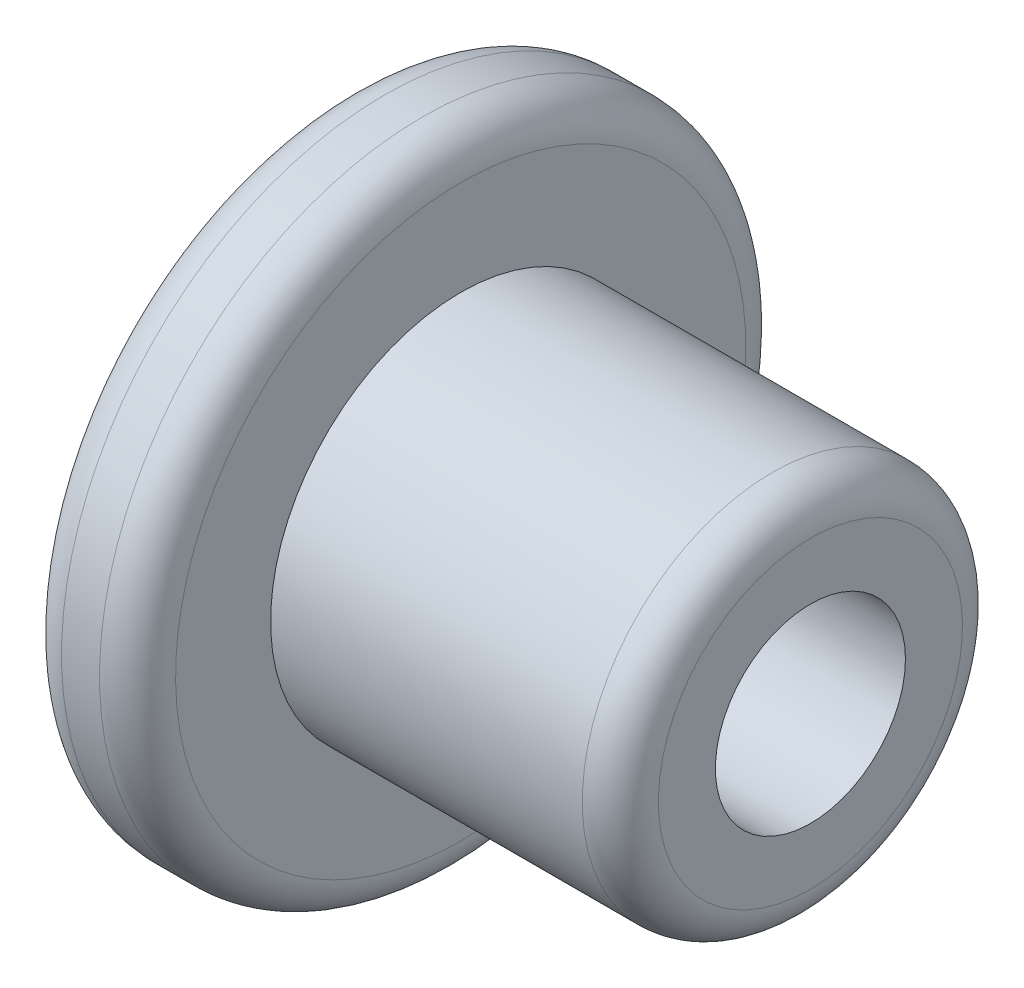
ISO-10303-21;
HEADER;
FILE_DESCRIPTION(('STEP AP214'),'2;1');
FILE_NAME('part.step','',(''),(''),'','','');
FILE_SCHEMA(('AUTOMOTIVE_DESIGN { 1 0 10303 214 1 1 1 1 }'));
ENDSEC;
DATA;
#1=APPLICATION_CONTEXT('core data for automotive mechanical design processes');
#2=APPLICATION_PROTOCOL_DEFINITION('international standard','automotive_design',2000,#1);
#3=PRODUCT_CONTEXT('',#1,'mechanical');
#4=PRODUCT('Part','Part','',(#3));
#5=PRODUCT_RELATED_PRODUCT_CATEGORY('part','',(#4));
#6=PRODUCT_DEFINITION_FORMATION('','',#4);
#7=PRODUCT_DEFINITION_CONTEXT('part definition',#1,'design');
#8=PRODUCT_DEFINITION('design','',#6,#7);
#9=PRODUCT_DEFINITION_SHAPE('','',#8);
#10=(LENGTH_UNIT() NAMED_UNIT(*) SI_UNIT(.MILLI.,.METRE.));
#11=(NAMED_UNIT(*) PLANE_ANGLE_UNIT() SI_UNIT($,.RADIAN.));
#12=(NAMED_UNIT(*) SI_UNIT($,.STERADIAN.) SOLID_ANGLE_UNIT());
#13=UNCERTAINTY_MEASURE_WITH_UNIT(LENGTH_MEASURE(1.E-05),#10,'distance_accuracy_value','');
#14=(GEOMETRIC_REPRESENTATION_CONTEXT(3) GLOBAL_UNCERTAINTY_ASSIGNED_CONTEXT((#13)) GLOBAL_UNIT_ASSIGNED_CONTEXT((#10,
#11,#12)) REPRESENTATION_CONTEXT('',''));
#15=CARTESIAN_POINT('',(0.,0.,0.));
#16=DIRECTION('',(0.,0.,1.));
#17=DIRECTION('',(1.,0.,0.));
#18=AXIS2_PLACEMENT_3D('',#15,#16,#17);
#19=CARTESIAN_POINT('',(0.,0.,0.));
#20=DIRECTION('',(-1.,0.,0.));
#21=DIRECTION('',(0.,-1.,0.));
#22=AXIS2_PLACEMENT_3D('',#19,#20,#21);
#23=PLANE('',#22);
#24=CARTESIAN_POINT('',(0.,0.,0.));
#25=DIRECTION('',(-1.,0.,0.));
#26=DIRECTION('',(0.,-1.,0.));
#27=AXIS2_PLACEMENT_3D('',#24,#25,#26);
#28=CIRCLE('',#27,3.75);
#29=CARTESIAN_POINT('',(0.,-3.75,0.));
#30=VERTEX_POINT('',#29);
#31=EDGE_CURVE('E73',#30,#30,#28,.F.);
#32=ORIENTED_EDGE('',*,*,#31,.T.);
#33=EDGE_LOOP('',(#32));
#34=FACE_BOUND('',#33,.T.);
#35=CARTESIAN_POINT('',(0.,0.,0.));
#36=DIRECTION('',(1.,0.,0.));
#37=DIRECTION('',(0.,1.,0.));
#38=AXIS2_PLACEMENT_3D('',#35,#36,#37);
#39=CIRCLE('',#38,2.5);
#40=CARTESIAN_POINT('',(0.,2.5,0.));
#41=VERTEX_POINT('',#40);
#42=EDGE_CURVE('E59',#41,#41,#39,.T.);
#43=ORIENTED_EDGE('',*,*,#42,.F.);
#44=EDGE_LOOP('',(#43));
#45=FACE_BOUND('',#44,.T.);
#46=ADVANCED_FACE('F40',(#34,#45),#23,.F.);
#47=CARTESIAN_POINT('',(0.,0.,0.));
#48=DIRECTION('',(1.,0.,0.));
#49=DIRECTION('',(0.,1.,0.));
#50=AXIS2_PLACEMENT_3D('',#47,#48,#49);
#51=CYLINDRICAL_SURFACE('',#50,4.25);
#52=CARTESIAN_POINT('',(-0.5,0.,0.));
#53=DIRECTION('',(-1.,0.,0.));
#54=DIRECTION('',(0.,-1.,0.));
#55=AXIS2_PLACEMENT_3D('',#52,#53,#54);
#56=CIRCLE('',#55,4.25);
#57=CARTESIAN_POINT('',(-0.499999999999999,-4.25,0.));
#58=VERTEX_POINT('',#57);
#59=EDGE_CURVE('E47',#58,#58,#56,.T.);
#60=ORIENTED_EDGE('',*,*,#59,.T.);
#61=EDGE_LOOP('',(#60));
#62=FACE_BOUND('',#61,.T.);
#63=CARTESIAN_POINT('',(-1.,0.,0.));
#64=DIRECTION('',(1.,0.,0.));
#65=DIRECTION('',(0.,1.,0.));
#66=AXIS2_PLACEMENT_3D('',#63,#64,#65);
#67=CIRCLE('',#66,4.25);
#68=CARTESIAN_POINT('',(-1.,4.25,0.));
#69=VERTEX_POINT('',#68);
#70=EDGE_CURVE('E76',#69,#69,#67,.T.);
#71=ORIENTED_EDGE('',*,*,#70,.T.);
#72=EDGE_LOOP('',(#71));
#73=FACE_BOUND('',#72,.T.);
#74=ADVANCED_FACE('F81',(#62,#73),#51,.T.);
#75=CARTESIAN_POINT('',(-1.5,0.,0.));
#76=DIRECTION('',(1.,0.,0.));
#77=DIRECTION('',(0.,1.,0.));
#78=AXIS2_PLACEMENT_3D('',#75,#76,#77);
#79=PLANE('',#78);
#80=CARTESIAN_POINT('',(-1.5,0.,0.));
#81=DIRECTION('',(1.,0.,0.));
#82=DIRECTION('',(0.,1.,0.));
#83=AXIS2_PLACEMENT_3D('',#80,#81,#82);
#84=CIRCLE('',#83,3.75);
#85=CARTESIAN_POINT('',(-1.5,3.75,0.));
#86=VERTEX_POINT('',#85);
#87=EDGE_CURVE('E11',#86,#86,#84,.F.);
#88=ORIENTED_EDGE('',*,*,#87,.T.);
#89=EDGE_LOOP('',(#88));
#90=FACE_BOUND('',#89,.T.);
#91=ADVANCED_FACE('F106',(#90),#79,.F.);
#92=CARTESIAN_POINT('',(4.6,0.,0.));
#93=DIRECTION('',(-1.,0.,0.));
#94=DIRECTION('',(0.,-1.,0.));
#95=AXIS2_PLACEMENT_3D('',#92,#93,#94);
#96=PLANE('',#95);
#97=CARTESIAN_POINT('',(4.6,0.,0.));
#98=DIRECTION('',(1.,0.,0.));
#99=DIRECTION('',(0.,0.,-1.));
#100=AXIS2_PLACEMENT_3D('',#97,#98,#99);
#101=CIRCLE('',#100,1.25);
#102=CARTESIAN_POINT('',(4.6,0.,-1.25));
#103=VERTEX_POINT('',#102);
#104=EDGE_CURVE('E60',#103,#103,#101,.T.);
#105=ORIENTED_EDGE('',*,*,#104,.F.);
#106=EDGE_LOOP('',(#105));
#107=FACE_BOUND('',#106,.T.);
#108=CARTESIAN_POINT('',(4.6,0.,0.));
#109=DIRECTION('',(-1.,0.,0.));
#110=DIRECTION('',(0.,-1.,0.));
#111=AXIS2_PLACEMENT_3D('',#108,#109,#110);
#112=CIRCLE('',#111,2.);
#113=CARTESIAN_POINT('',(4.6,-2.,0.));
#114=VERTEX_POINT('',#113);
#115=EDGE_CURVE('E63',#114,#114,#112,.F.);
#116=ORIENTED_EDGE('',*,*,#115,.T.);
#117=EDGE_LOOP('',(#116));
#118=FACE_BOUND('',#117,.T.);
#119=ADVANCED_FACE('F97',(#107,#118),#96,.F.);
#120=CARTESIAN_POINT('',(0.,0.,0.));
#121=DIRECTION('',(1.,0.,0.));
#122=DIRECTION('',(0.,1.,0.));
#123=AXIS2_PLACEMENT_3D('',#120,#121,#122);
#124=CYLINDRICAL_SURFACE('',#123,2.5);
#125=CARTESIAN_POINT('',(4.1,0.,0.));
#126=DIRECTION('',(-1.,0.,0.));
#127=DIRECTION('',(0.,-1.,0.));
#128=AXIS2_PLACEMENT_3D('',#125,#126,#127);
#129=CIRCLE('',#128,2.5);
#130=CARTESIAN_POINT('',(4.1,-2.5,0.));
#131=VERTEX_POINT('',#130);
#132=EDGE_CURVE('E70',#131,#131,#129,.T.);
#133=ORIENTED_EDGE('',*,*,#132,.T.);
#134=EDGE_LOOP('',(#133));
#135=FACE_BOUND('',#134,.T.);
#136=ORIENTED_EDGE('',*,*,#42,.T.);
#137=EDGE_LOOP('',(#136));
#138=FACE_BOUND('',#137,.T.);
#139=ADVANCED_FACE('F95',(#135,#138),#124,.T.);
#140=CARTESIAN_POINT('',(4.1,0.,0.));
#141=DIRECTION('',(-1.,0.,0.));
#142=DIRECTION('',(0.,-1.,0.));
#143=AXIS2_PLACEMENT_3D('',#140,#141,#142);
#144=TOROIDAL_SURFACE('',#143,2.,0.5);
#145=ORIENTED_EDGE('',*,*,#132,.F.);
#146=EDGE_LOOP('',(#145));
#147=FACE_BOUND('',#146,.T.);
#148=ORIENTED_EDGE('',*,*,#115,.F.);
#149=EDGE_LOOP('',(#148));
#150=FACE_BOUND('',#149,.T.);
#151=ADVANCED_FACE('F87',(#147,#150),#144,.T.);
#152=CARTESIAN_POINT('',(-0.5,0.,0.));
#153=DIRECTION('',(-1.,0.,0.));
#154=DIRECTION('',(0.,-1.,0.));
#155=AXIS2_PLACEMENT_3D('',#152,#153,#154);
#156=TOROIDAL_SURFACE('',#155,3.75,0.5);
#157=ORIENTED_EDGE('',*,*,#59,.F.);
#158=EDGE_LOOP('',(#157));
#159=FACE_BOUND('',#158,.T.);
#160=ORIENTED_EDGE('',*,*,#31,.F.);
#161=EDGE_LOOP('',(#160));
#162=FACE_BOUND('',#161,.T.);
#163=ADVANCED_FACE('F84',(#159,#162),#156,.T.);
#164=CARTESIAN_POINT('',(-1.,0.,0.));
#165=DIRECTION('',(1.,0.,0.));
#166=DIRECTION('',(0.,1.,0.));
#167=AXIS2_PLACEMENT_3D('',#164,#165,#166);
#168=TOROIDAL_SURFACE('',#167,3.75,0.5);
#169=ORIENTED_EDGE('',*,*,#87,.F.);
#170=EDGE_LOOP('',(#169));
#171=FACE_BOUND('',#170,.T.);
#172=ORIENTED_EDGE('',*,*,#70,.F.);
#173=EDGE_LOOP('',(#172));
#174=FACE_BOUND('',#173,.T.);
#175=ADVANCED_FACE('F42',(#171,#174),#168,.T.);
#176=CARTESIAN_POINT('',(0.6,0.,0.));
#177=DIRECTION('',(1.,0.,0.));
#178=DIRECTION('',(0.,0.,-1.));
#179=AXIS2_PLACEMENT_3D('',#176,#177,#178);
#180=CONICAL_SURFACE('',#179,1.25,1.02974425867665);
#181=CARTESIAN_POINT('',(-0.151075773784451,0.,0.));
#182=VERTEX_POINT('',#181);
#183=VERTEX_LOOP('',#182);
#184=FACE_BOUND('',#183,.T.);
#185=CARTESIAN_POINT('',(0.6,0.,0.));
#186=DIRECTION('',(1.,0.,0.));
#187=DIRECTION('',(0.,0.,-1.));
#188=AXIS2_PLACEMENT_3D('',#185,#186,#187);
#189=CIRCLE('',#188,1.25);
#190=CARTESIAN_POINT('',(0.6,0.,-1.25));
#191=VERTEX_POINT('',#190);
#192=EDGE_CURVE('E57',#191,#191,#189,.T.);
#193=ORIENTED_EDGE('',*,*,#192,.T.);
#194=EDGE_LOOP('',(#193));
#195=FACE_BOUND('',#194,.T.);
#196=ADVANCED_FACE('F50',(#184,#195),#180,.F.);
#197=CARTESIAN_POINT('',(4.6,0.,0.));
#198=DIRECTION('',(1.,0.,0.));
#199=DIRECTION('',(0.,0.,-1.));
#200=AXIS2_PLACEMENT_3D('',#197,#198,#199);
#201=CYLINDRICAL_SURFACE('',#200,1.25);
#202=ORIENTED_EDGE('',*,*,#192,.F.);
#203=EDGE_LOOP('',(#202));
#204=FACE_BOUND('',#203,.T.);
#205=ORIENTED_EDGE('',*,*,#104,.T.);
#206=EDGE_LOOP('',(#205));
#207=FACE_BOUND('',#206,.T.);
#208=ADVANCED_FACE('F53',(#204,#207),#201,.F.);
#209=CLOSED_SHELL('',(#46,#74,#91,#119,#139,#151,#163,#175,#196,#208));
#210=MANIFOLD_SOLID_BREP('B2',#209);
#211=ADVANCED_BREP_SHAPE_REPRESENTATION('',(#18,#210),#14);
#212=SHAPE_DEFINITION_REPRESENTATION(#9,#211);
ENDSEC;
END-ISO-10303-21;
